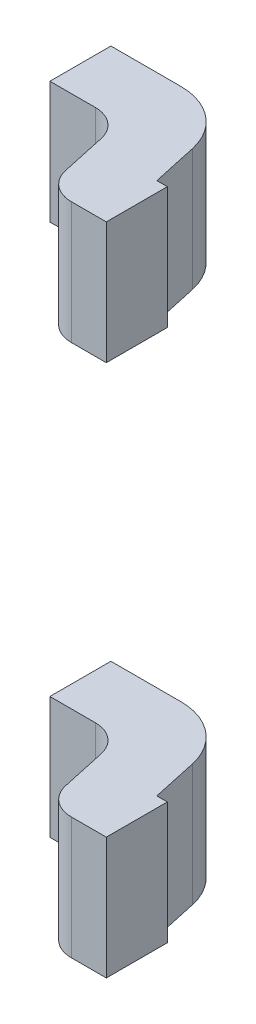
ISO-10303-21;
HEADER;
FILE_DESCRIPTION(('STEP AP214'),'2;1');
FILE_NAME('part.step','',(''),(''),'','','');
FILE_SCHEMA(('AUTOMOTIVE_DESIGN { 1 0 10303 214 1 1 1 1 }'));
ENDSEC;
DATA;
#1=APPLICATION_CONTEXT('core data for automotive mechanical design processes');
#2=APPLICATION_PROTOCOL_DEFINITION('international standard','automotive_design',2000,#1);
#3=PRODUCT_CONTEXT('',#1,'mechanical');
#4=PRODUCT('Part','Part','',(#3));
#5=PRODUCT_RELATED_PRODUCT_CATEGORY('part','',(#4));
#6=PRODUCT_DEFINITION_FORMATION('','',#4);
#7=PRODUCT_DEFINITION_CONTEXT('part definition',#1,'design');
#8=PRODUCT_DEFINITION('design','',#6,#7);
#9=PRODUCT_DEFINITION_SHAPE('','',#8);
#10=(LENGTH_UNIT() NAMED_UNIT(*) SI_UNIT(.MILLI.,.METRE.));
#11=(NAMED_UNIT(*) PLANE_ANGLE_UNIT() SI_UNIT($,.RADIAN.));
#12=(NAMED_UNIT(*) SI_UNIT($,.STERADIAN.) SOLID_ANGLE_UNIT());
#13=UNCERTAINTY_MEASURE_WITH_UNIT(LENGTH_MEASURE(1.E-05),#10,'distance_accuracy_value','');
#14=(GEOMETRIC_REPRESENTATION_CONTEXT(3) GLOBAL_UNCERTAINTY_ASSIGNED_CONTEXT((#13)) GLOBAL_UNIT_ASSIGNED_CONTEXT((#10,
#11,#12)) REPRESENTATION_CONTEXT('',''));
#15=CARTESIAN_POINT('',(0.,0.,0.));
#16=DIRECTION('',(0.,0.,1.));
#17=DIRECTION('',(1.,0.,0.));
#18=AXIS2_PLACEMENT_3D('',#15,#16,#17);
#19=CARTESIAN_POINT('',(-1.185,-1.1675,0.));
#20=DIRECTION('',(0.,1.,0.));
#21=DIRECTION('',(0.,0.,1.));
#22=AXIS2_PLACEMENT_3D('',#19,#20,#21);
#23=PLANE('',#22);
#24=DIRECTION('',(-0.212831260699979,0.,-0.977088969576905));
#25=VECTOR('',#24,1.);
#26=CARTESIAN_POINT('',(-0.76,-1.1675,0.));
#27=LINE('',#26,#25);
#28=CARTESIAN_POINT('',(-0.687293093243104,-1.1675,0.333790799202015));
#29=VERTEX_POINT('',#28);
#30=CARTESIAN_POINT('',(-0.722706906756945,-1.1675,0.171209200797863));
#31=VERTEX_POINT('',#30);
#32=EDGE_CURVE('P0_E121',#29,#31,#27,.T.);
#33=ORIENTED_EDGE('',*,*,#32,.F.);
#34=DIRECTION('',(1.,0.,0.));
#35=VECTOR('',#34,1.);
#36=CARTESIAN_POINT('',(-0.862516850883,-1.1675,0.333790799202));
#37=LINE('',#36,#35);
#38=CARTESIAN_POINT('',(-0.65,-1.1675,0.333790799202));
#39=VERTEX_POINT('',#38);
#40=EDGE_CURVE('P0_E122',#29,#39,#37,.T.);
#41=ORIENTED_EDGE('',*,*,#40,.T.);
#42=DIRECTION('',(0.,0.,-1.));
#43=VECTOR('',#42,1.);
#44=CARTESIAN_POINT('',(-0.65,-1.1675,0.333790799202));
#45=LINE('',#44,#43);
#46=CARTESIAN_POINT('',(-0.65,-1.1675,0.551290799202));
#47=VERTEX_POINT('',#46);
#48=EDGE_CURVE('P0_E118',#47,#39,#45,.T.);
#49=ORIENTED_EDGE('',*,*,#48,.F.);
#50=DIRECTION('',(1.,0.,0.));
#51=VECTOR('',#50,1.);
#52=CARTESIAN_POINT('',(-0.862516850883,-1.1675,0.551290799202));
#53=LINE('',#52,#51);
#54=CARTESIAN_POINT('',(-0.774904972063,-1.1675,0.551290799202));
#55=VERTEX_POINT('',#54);
#56=EDGE_CURVE('P0_E151',#55,#47,#53,.T.);
#57=ORIENTED_EDGE('',*,*,#56,.F.);
#58=CARTESIAN_POINT('',(-0.774904972063,-1.1675,0.442540799202));
#59=DIRECTION('',(0.,1.,0.));
#60=DIRECTION('',(0.,0.,1.));
#61=AXIS2_PLACEMENT_3D('',#58,#59,#60);
#62=CIRCLE('',#61,0.10875);
#63=CARTESIAN_POINT('',(-0.881163397504548,-1.1675,0.465686198803019));
#64=VERTEX_POINT('',#63);
#65=EDGE_CURVE('P0_E155',#64,#55,#62,.T.);
#66=ORIENTED_EDGE('',*,*,#65,.F.);
#67=DIRECTION('',(-0.212831260699979,0.,-0.977088969576905));
#68=VECTOR('',#67,1.);
#69=CARTESIAN_POINT('',(-0.972516850883,-1.1675,0.04629079920223));
#70=LINE('',#69,#68);
#71=CARTESIAN_POINT('',(-0.91657721101835,-1.1675,0.303104600398959));
#72=VERTEX_POINT('',#71);
#73=EDGE_CURVE('P0_E79',#64,#72,#70,.T.);
#74=ORIENTED_EDGE('',*,*,#73,.T.);
#75=CARTESIAN_POINT('',(-1.02283563646,-1.1675,0.32625));
#76=DIRECTION('',(0.,1.,0.));
#77=DIRECTION('',(0.,0.,1.));
#78=AXIS2_PLACEMENT_3D('',#75,#76,#77);
#79=CIRCLE('',#78,0.10875);
#80=CARTESIAN_POINT('',(-1.02283563646,-1.1675,0.2175));
#81=VERTEX_POINT('',#80);
#82=EDGE_CURVE('P0_E20',#72,#81,#79,.T.);
#83=ORIENTED_EDGE('',*,*,#82,.T.);
#84=DIRECTION('',(1.,0.,0.));
#85=VECTOR('',#84,1.);
#86=CARTESIAN_POINT('',(-1.185,-1.1675,0.2175));
#87=LINE('',#86,#85);
#88=CARTESIAN_POINT('',(-1.185,-1.1675,0.2175));
#89=VERTEX_POINT('',#88);
#90=EDGE_CURVE('P0_E86',#89,#81,#87,.T.);
#91=ORIENTED_EDGE('',*,*,#90,.F.);
#92=DIRECTION('',(0.,0.,-1.));
#93=VECTOR('',#92,1.);
#94=CARTESIAN_POINT('',(-1.185,-1.1675,0.));
#95=LINE('',#94,#93);
#96=CARTESIAN_POINT('',(-1.185,-1.1675,0.));
#97=VERTEX_POINT('',#96);
#98=EDGE_CURVE('P0_E92',#89,#97,#95,.T.);
#99=ORIENTED_EDGE('',*,*,#98,.T.);
#100=DIRECTION('',(1.,0.,0.));
#101=VECTOR('',#100,1.);
#102=CARTESIAN_POINT('',(-1.185,-1.1675,0.));
#103=LINE('',#102,#101);
#104=CARTESIAN_POINT('',(-0.93522375764,-1.1675,0.));
#105=VERTEX_POINT('',#104);
#106=EDGE_CURVE('P0_E178',#97,#105,#103,.T.);
#107=ORIENTED_EDGE('',*,*,#106,.T.);
#108=CARTESIAN_POINT('',(-0.93522375764,-1.1675,0.2175));
#109=DIRECTION('',(0.,1.,0.));
#110=DIRECTION('',(0.,0.,1.));
#111=AXIS2_PLACEMENT_3D('',#108,#109,#110);
#112=CIRCLE('',#111,0.2175);
#113=EDGE_CURVE('P0_E204',#31,#105,#112,.T.);
#114=ORIENTED_EDGE('',*,*,#113,.F.);
#115=EDGE_LOOP('',(#33,#41,#49,#57,#66,#74,#83,#91,#99,#107,#114));
#116=FACE_BOUND('',#115,.T.);
#117=ADVANCED_FACE('P0_F17',(#116),#23,.F.);
#118=CARTESIAN_POINT('',(-1.185,-1.1675,0.));
#119=DIRECTION('',(0.,0.,1.));
#120=DIRECTION('',(1.,0.,0.));
#121=AXIS2_PLACEMENT_3D('',#118,#119,#120);
#122=PLANE('',#121);
#123=ORIENTED_EDGE('',*,*,#106,.F.);
#124=DIRECTION('',(0.,1.,0.));
#125=VECTOR('',#124,1.);
#126=CARTESIAN_POINT('',(-1.185,-1.1675,0.));
#127=LINE('',#126,#125);
#128=CARTESIAN_POINT('',(-1.185,-0.7325,0.));
#129=VERTEX_POINT('',#128);
#130=EDGE_CURVE('P0_E162',#97,#129,#127,.T.);
#131=ORIENTED_EDGE('',*,*,#130,.T.);
#132=DIRECTION('',(1.,0.,0.));
#133=VECTOR('',#132,1.);
#134=CARTESIAN_POINT('',(-1.185,-0.7325,0.));
#135=LINE('',#134,#133);
#136=CARTESIAN_POINT('',(-0.93522375764,-0.7325,0.));
#137=VERTEX_POINT('',#136);
#138=EDGE_CURVE('P0_E169',#137,#129,#135,.F.);
#139=ORIENTED_EDGE('',*,*,#138,.F.);
#140=DIRECTION('',(0.,1.,0.));
#141=VECTOR('',#140,1.);
#142=CARTESIAN_POINT('',(-0.93522375764,-1.1675,0.));
#143=LINE('',#142,#141);
#144=EDGE_CURVE('P0_E229',#105,#137,#143,.T.);
#145=ORIENTED_EDGE('',*,*,#144,.F.);
#146=EDGE_LOOP('',(#123,#131,#139,#145));
#147=FACE_BOUND('',#146,.T.);
#148=ADVANCED_FACE('P0_F247',(#147),#122,.F.);
#149=CARTESIAN_POINT('',(-1.185,-1.1675,0.));
#150=DIRECTION('',(1.,0.,0.));
#151=DIRECTION('',(0.,0.,-1.));
#152=AXIS2_PLACEMENT_3D('',#149,#150,#151);
#153=PLANE('',#152);
#154=DIRECTION('',(0.,0.,1.));
#155=VECTOR('',#154,1.);
#156=CARTESIAN_POINT('',(-1.185,-0.7325,0.));
#157=LINE('',#156,#155);
#158=CARTESIAN_POINT('',(-1.185,-0.7325,0.2175));
#159=VERTEX_POINT('',#158);
#160=EDGE_CURVE('P0_E165',#129,#159,#157,.T.);
#161=ORIENTED_EDGE('',*,*,#160,.F.);
#162=ORIENTED_EDGE('',*,*,#130,.F.);
#163=ORIENTED_EDGE('',*,*,#98,.F.);
#164=DIRECTION('',(0.,1.,0.));
#165=VECTOR('',#164,1.);
#166=CARTESIAN_POINT('',(-1.185,-1.1675,0.2175));
#167=LINE('',#166,#165);
#168=EDGE_CURVE('P0_E160',#159,#89,#167,.F.);
#169=ORIENTED_EDGE('',*,*,#168,.F.);
#170=EDGE_LOOP('',(#161,#162,#163,#169));
#171=FACE_BOUND('',#170,.T.);
#172=ADVANCED_FACE('P0_F249',(#171),#153,.F.);
#173=CARTESIAN_POINT('',(-1.185,-1.1675,0.2175));
#174=DIRECTION('',(0.,0.,1.));
#175=DIRECTION('',(1.,0.,0.));
#176=AXIS2_PLACEMENT_3D('',#173,#174,#175);
#177=PLANE('',#176);
#178=ORIENTED_EDGE('',*,*,#90,.T.);
#179=DIRECTION('',(0.,1.,0.));
#180=VECTOR('',#179,1.);
#181=CARTESIAN_POINT('',(-1.02283563646,-1.1675,0.2175));
#182=LINE('',#181,#180);
#183=CARTESIAN_POINT('',(-1.02283563646,-0.7325,0.2175));
#184=VERTEX_POINT('',#183);
#185=EDGE_CURVE('P0_E158',#81,#184,#182,.T.);
#186=ORIENTED_EDGE('',*,*,#185,.T.);
#187=DIRECTION('',(1.,0.,0.));
#188=VECTOR('',#187,1.);
#189=CARTESIAN_POINT('',(-1.185,-0.7325,0.2175));
#190=LINE('',#189,#188);
#191=EDGE_CURVE('P0_E168',#159,#184,#190,.T.);
#192=ORIENTED_EDGE('',*,*,#191,.F.);
#193=ORIENTED_EDGE('',*,*,#168,.T.);
#194=EDGE_LOOP('',(#178,#186,#192,#193));
#195=FACE_BOUND('',#194,.T.);
#196=ADVANCED_FACE('P0_F251',(#195),#177,.T.);
#197=CARTESIAN_POINT('',(-1.02283563646,-1.1675,0.32625));
#198=DIRECTION('',(0.,1.,0.));
#199=DIRECTION('',(0.,0.,1.));
#200=AXIS2_PLACEMENT_3D('',#197,#198,#199);
#201=CYLINDRICAL_SURFACE('',#200,0.10875);
#202=DIRECTION('',(0.,1.,0.));
#203=VECTOR('',#202,1.);
#204=CARTESIAN_POINT('',(-0.916577211018326,-1.1675,0.303104600399071));
#205=LINE('',#204,#203);
#206=CARTESIAN_POINT('',(-0.916577211018136,-0.7325,0.303104600399158));
#207=VERTEX_POINT('',#206);
#208=EDGE_CURVE('P0_E156',#72,#207,#205,.T.);
#209=ORIENTED_EDGE('',*,*,#208,.T.);
#210=CARTESIAN_POINT('',(-1.02283563646,-0.7325,0.32625));
#211=DIRECTION('',(0.,1.,0.));
#212=DIRECTION('',(0.,0.,1.));
#213=AXIS2_PLACEMENT_3D('',#210,#211,#212);
#214=CIRCLE('',#213,0.10875);
#215=EDGE_CURVE('P0_E201',#184,#207,#214,.F.);
#216=ORIENTED_EDGE('',*,*,#215,.F.);
#217=ORIENTED_EDGE('',*,*,#185,.F.);
#218=ORIENTED_EDGE('',*,*,#82,.F.);
#219=EDGE_LOOP('',(#209,#216,#217,#218));
#220=FACE_BOUND('',#219,.T.);
#221=ADVANCED_FACE('P0_F254',(#220),#201,.F.);
#222=CARTESIAN_POINT('',(-0.972516850883,-1.1675,0.04629079920223));
#223=DIRECTION('',(0.977088969576905,0.,-0.212831260699979));
#224=DIRECTION('',(-0.212831260699979,0.,-0.977088969576905));
#225=AXIS2_PLACEMENT_3D('',#222,#223,#224);
#226=PLANE('',#225);
#227=DIRECTION('',(0.212831260695663,0.,0.977088969577845));
#228=VECTOR('',#227,1.);
#229=CARTESIAN_POINT('',(-0.916577211018,-0.7325,0.303104600399));
#230=LINE('',#229,#228);
#231=CARTESIAN_POINT('',(-0.881163397504795,-0.7325,0.465686198802827));
#232=VERTEX_POINT('',#231);
#233=EDGE_CURVE('P0_E200',#207,#232,#230,.T.);
#234=ORIENTED_EDGE('',*,*,#233,.F.);
#235=ORIENTED_EDGE('',*,*,#208,.F.);
#236=ORIENTED_EDGE('',*,*,#73,.F.);
#237=DIRECTION('',(0.,1.,0.));
#238=VECTOR('',#237,1.);
#239=CARTESIAN_POINT('',(-0.881163397504537,-1.1675,0.465686198802899));
#240=LINE('',#239,#238);
#241=EDGE_CURVE('P0_E152',#232,#64,#240,.F.);
#242=ORIENTED_EDGE('',*,*,#241,.F.);
#243=EDGE_LOOP('',(#234,#235,#236,#242));
#244=FACE_BOUND('',#243,.T.);
#245=ADVANCED_FACE('P0_F255',(#244),#226,.F.);
#246=CARTESIAN_POINT('',(-0.774904972063,-1.1675,0.442540799202));
#247=DIRECTION('',(0.,1.,0.));
#248=DIRECTION('',(0.,0.,1.));
#249=AXIS2_PLACEMENT_3D('',#246,#247,#248);
#250=CYLINDRICAL_SURFACE('',#249,0.10875);
#251=CARTESIAN_POINT('',(-0.774904972063,-0.7325,0.442540799202));
#252=DIRECTION('',(0.,1.,0.));
#253=DIRECTION('',(0.,0.,1.));
#254=AXIS2_PLACEMENT_3D('',#251,#252,#253);
#255=CIRCLE('',#254,0.10875);
#256=CARTESIAN_POINT('',(-0.774904972063,-0.7325,0.551290799202));
#257=VERTEX_POINT('',#256);
#258=EDGE_CURVE('P0_E137',#232,#257,#255,.T.);
#259=ORIENTED_EDGE('',*,*,#258,.F.);
#260=ORIENTED_EDGE('',*,*,#241,.T.);
#261=ORIENTED_EDGE('',*,*,#65,.T.);
#262=DIRECTION('',(0.,1.,0.));
#263=VECTOR('',#262,1.);
#264=CARTESIAN_POINT('',(-0.774904972063,-1.1675,0.551290799202));
#265=LINE('',#264,#263);
#266=EDGE_CURVE('P0_E148',#257,#55,#265,.F.);
#267=ORIENTED_EDGE('',*,*,#266,.F.);
#268=EDGE_LOOP('',(#259,#260,#261,#267));
#269=FACE_BOUND('',#268,.T.);
#270=ADVANCED_FACE('P0_F209',(#269),#250,.T.);
#271=CARTESIAN_POINT('',(-0.862516850883,-1.1675,0.551290799202));
#272=DIRECTION('',(0.,0.,1.));
#273=DIRECTION('',(1.,0.,0.));
#274=AXIS2_PLACEMENT_3D('',#271,#272,#273);
#275=PLANE('',#274);
#276=DIRECTION('',(1.,0.,0.));
#277=VECTOR('',#276,1.);
#278=CARTESIAN_POINT('',(-1.185,-0.7325,0.551290799202));
#279=LINE('',#278,#277);
#280=CARTESIAN_POINT('',(-0.65,-0.7325,0.551290799202));
#281=VERTEX_POINT('',#280);
#282=EDGE_CURVE('P0_E135',#257,#281,#279,.T.);
#283=ORIENTED_EDGE('',*,*,#282,.F.);
#284=ORIENTED_EDGE('',*,*,#266,.T.);
#285=ORIENTED_EDGE('',*,*,#56,.T.);
#286=DIRECTION('',(0.,1.,0.));
#287=VECTOR('',#286,1.);
#288=CARTESIAN_POINT('',(-0.65,-1.1675,0.551290799202));
#289=LINE('',#288,#287);
#290=EDGE_CURVE('P0_E144',#281,#47,#289,.F.);
#291=ORIENTED_EDGE('',*,*,#290,.F.);
#292=EDGE_LOOP('',(#283,#284,#285,#291));
#293=FACE_BOUND('',#292,.T.);
#294=ADVANCED_FACE('P0_F211',(#293),#275,.T.);
#295=CARTESIAN_POINT('',(-0.65,-1.1675,0.333790799202));
#296=DIRECTION('',(1.,0.,0.));
#297=DIRECTION('',(0.,0.,-1.));
#298=AXIS2_PLACEMENT_3D('',#295,#296,#297);
#299=PLANE('',#298);
#300=DIRECTION('',(0.,0.,1.));
#301=VECTOR('',#300,1.);
#302=CARTESIAN_POINT('',(-0.65,-0.7325,0.));
#303=LINE('',#302,#301);
#304=CARTESIAN_POINT('',(-0.65,-0.7325,0.333790799202));
#305=VERTEX_POINT('',#304);
#306=EDGE_CURVE('P0_E116',#281,#305,#303,.F.);
#307=ORIENTED_EDGE('',*,*,#306,.F.);
#308=ORIENTED_EDGE('',*,*,#290,.T.);
#309=ORIENTED_EDGE('',*,*,#48,.T.);
#310=DIRECTION('',(0.,1.,0.));
#311=VECTOR('',#310,1.);
#312=CARTESIAN_POINT('',(-0.65,-1.1675,0.333790799202));
#313=LINE('',#312,#311);
#314=EDGE_CURVE('P0_E111',#39,#305,#313,.T.);
#315=ORIENTED_EDGE('',*,*,#314,.T.);
#316=EDGE_LOOP('',(#307,#308,#309,#315));
#317=FACE_BOUND('',#316,.T.);
#318=ADVANCED_FACE('P0_F113',(#317),#299,.T.);
#319=CARTESIAN_POINT('',(-0.862516850883,-1.1675,0.333790799202));
#320=DIRECTION('',(0.,0.,1.));
#321=DIRECTION('',(1.,0.,0.));
#322=AXIS2_PLACEMENT_3D('',#319,#320,#321);
#323=PLANE('',#322);
#324=ORIENTED_EDGE('',*,*,#40,.F.);
#325=DIRECTION('',(0.,1.,0.));
#326=VECTOR('',#325,1.);
#327=CARTESIAN_POINT('',(-0.687293093243104,-1.1675,0.333790799202023));
#328=LINE('',#327,#326);
#329=CARTESIAN_POINT('',(-0.687293093243035,-0.7325,0.333790799202008));
#330=VERTEX_POINT('',#329);
#331=EDGE_CURVE('P0_E128',#330,#29,#328,.F.);
#332=ORIENTED_EDGE('',*,*,#331,.F.);
#333=DIRECTION('',(1.,0.,0.));
#334=VECTOR('',#333,1.);
#335=CARTESIAN_POINT('',(-1.185,-0.7325,0.333790799202));
#336=LINE('',#335,#334);
#337=EDGE_CURVE('P0_E125',#305,#330,#336,.F.);
#338=ORIENTED_EDGE('',*,*,#337,.F.);
#339=ORIENTED_EDGE('',*,*,#314,.F.);
#340=EDGE_LOOP('',(#324,#332,#338,#339));
#341=FACE_BOUND('',#340,.T.);
#342=ADVANCED_FACE('P0_F126',(#341),#323,.F.);
#343=CARTESIAN_POINT('',(-0.76,-1.1675,0.));
#344=DIRECTION('',(0.977088969576905,0.,-0.212831260699979));
#345=DIRECTION('',(-0.212831260699979,0.,-0.977088969576905));
#346=AXIS2_PLACEMENT_3D('',#343,#344,#345);
#347=PLANE('',#346);
#348=DIRECTION('',(-0.212831260701399,0.,-0.977088969576595));
#349=VECTOR('',#348,1.);
#350=CARTESIAN_POINT('',(-0.687293093243,-0.7325,0.333790799202));
#351=LINE('',#350,#349);
#352=CARTESIAN_POINT('',(-0.722706906757045,-0.7325,0.171209200797723));
#353=VERTEX_POINT('',#352);
#354=EDGE_CURVE('P0_E26',#330,#353,#351,.T.);
#355=ORIENTED_EDGE('',*,*,#354,.F.);
#356=ORIENTED_EDGE('',*,*,#331,.T.);
#357=ORIENTED_EDGE('',*,*,#32,.T.);
#358=DIRECTION('',(0.,1.,0.));
#359=VECTOR('',#358,1.);
#360=CARTESIAN_POINT('',(-0.722706906756971,-1.1675,0.171209200797994));
#361=LINE('',#360,#359);
#362=EDGE_CURVE('P0_E35',#353,#31,#361,.F.);
#363=ORIENTED_EDGE('',*,*,#362,.F.);
#364=EDGE_LOOP('',(#355,#356,#357,#363));
#365=FACE_BOUND('',#364,.T.);
#366=ADVANCED_FACE('P0_F237',(#365),#347,.T.);
#367=CARTESIAN_POINT('',(-0.93522375764,-1.1675,0.2175));
#368=DIRECTION('',(0.,1.,0.));
#369=DIRECTION('',(0.,0.,1.));
#370=AXIS2_PLACEMENT_3D('',#367,#368,#369);
#371=CYLINDRICAL_SURFACE('',#370,0.2175);
#372=ORIENTED_EDGE('',*,*,#362,.T.);
#373=ORIENTED_EDGE('',*,*,#113,.T.);
#374=ORIENTED_EDGE('',*,*,#144,.T.);
#375=CARTESIAN_POINT('',(-0.93522375764,-0.7325,0.2175));
#376=DIRECTION('',(0.,1.,0.));
#377=DIRECTION('',(0.,0.,1.));
#378=AXIS2_PLACEMENT_3D('',#375,#376,#377);
#379=CIRCLE('',#378,0.2175);
#380=EDGE_CURVE('P0_E11',#353,#137,#379,.T.);
#381=ORIENTED_EDGE('',*,*,#380,.F.);
#382=EDGE_LOOP('',(#372,#373,#374,#381));
#383=FACE_BOUND('',#382,.T.);
#384=ADVANCED_FACE('P0_F243',(#383),#371,.T.);
#385=CARTESIAN_POINT('',(-1.185,-0.7325,0.));
#386=DIRECTION('',(0.,1.,0.));
#387=DIRECTION('',(0.,0.,1.));
#388=AXIS2_PLACEMENT_3D('',#385,#386,#387);
#389=PLANE('',#388);
#390=ORIENTED_EDGE('',*,*,#354,.T.);
#391=ORIENTED_EDGE('',*,*,#380,.T.);
#392=ORIENTED_EDGE('',*,*,#138,.T.);
#393=ORIENTED_EDGE('',*,*,#160,.T.);
#394=ORIENTED_EDGE('',*,*,#191,.T.);
#395=ORIENTED_EDGE('',*,*,#215,.T.);
#396=ORIENTED_EDGE('',*,*,#233,.T.);
#397=ORIENTED_EDGE('',*,*,#258,.T.);
#398=ORIENTED_EDGE('',*,*,#282,.T.);
#399=ORIENTED_EDGE('',*,*,#306,.T.);
#400=ORIENTED_EDGE('',*,*,#337,.T.);
#401=EDGE_LOOP('',(#390,#391,#392,#393,#394,#395,#396,#397,#398,#399,#400));
#402=FACE_BOUND('',#401,.T.);
#403=ADVANCED_FACE('P0_F132',(#402),#389,.T.);
#404=CLOSED_SHELL('',(#117,#148,#172,#196,#221,#245,#270,#294,#318,#342,#366,#384,#403));
#405=MANIFOLD_SOLID_BREP('P0_B1',#404);
#406=CARTESIAN_POINT('',(-1.185,0.7325,0.));
#407=DIRECTION('',(0.,1.,0.));
#408=DIRECTION('',(0.,0.,1.));
#409=AXIS2_PLACEMENT_3D('',#406,#407,#408);
#410=PLANE('',#409);
#411=DIRECTION('',(-0.212831260699979,0.,-0.977088969576905));
#412=VECTOR('',#411,1.);
#413=CARTESIAN_POINT('',(-0.76,0.7325,0.));
#414=LINE('',#413,#412);
#415=CARTESIAN_POINT('',(-0.687293093243104,0.7325,0.333790799202015));
#416=VERTEX_POINT('',#415);
#417=CARTESIAN_POINT('',(-0.722706906756945,0.7325,0.171209200797863));
#418=VERTEX_POINT('',#417);
#419=EDGE_CURVE('P1_E121',#416,#418,#414,.T.);
#420=ORIENTED_EDGE('',*,*,#419,.F.);
#421=DIRECTION('',(1.,0.,0.));
#422=VECTOR('',#421,1.);
#423=CARTESIAN_POINT('',(-0.862516850883,0.7325,0.333790799202));
#424=LINE('',#423,#422);
#425=CARTESIAN_POINT('',(-0.65,0.7325,0.333790799202));
#426=VERTEX_POINT('',#425);
#427=EDGE_CURVE('P1_E122',#416,#426,#424,.T.);
#428=ORIENTED_EDGE('',*,*,#427,.T.);
#429=DIRECTION('',(0.,0.,-1.));
#430=VECTOR('',#429,1.);
#431=CARTESIAN_POINT('',(-0.65,0.7325,0.333790799202));
#432=LINE('',#431,#430);
#433=CARTESIAN_POINT('',(-0.65,0.7325,0.551290799202));
#434=VERTEX_POINT('',#433);
#435=EDGE_CURVE('P1_E118',#434,#426,#432,.T.);
#436=ORIENTED_EDGE('',*,*,#435,.F.);
#437=DIRECTION('',(1.,0.,0.));
#438=VECTOR('',#437,1.);
#439=CARTESIAN_POINT('',(-0.862516850883,0.7325,0.551290799202));
#440=LINE('',#439,#438);
#441=CARTESIAN_POINT('',(-0.774904972063,0.7325,0.551290799202));
#442=VERTEX_POINT('',#441);
#443=EDGE_CURVE('P1_E151',#442,#434,#440,.T.);
#444=ORIENTED_EDGE('',*,*,#443,.F.);
#445=CARTESIAN_POINT('',(-0.774904972063,0.7325,0.442540799202));
#446=DIRECTION('',(0.,1.,0.));
#447=DIRECTION('',(0.,0.,1.));
#448=AXIS2_PLACEMENT_3D('',#445,#446,#447);
#449=CIRCLE('',#448,0.10875);
#450=CARTESIAN_POINT('',(-0.881163397504548,0.7325,0.465686198803019));
#451=VERTEX_POINT('',#450);
#452=EDGE_CURVE('P1_E155',#451,#442,#449,.T.);
#453=ORIENTED_EDGE('',*,*,#452,.F.);
#454=DIRECTION('',(-0.212831260699979,0.,-0.977088969576905));
#455=VECTOR('',#454,1.);
#456=CARTESIAN_POINT('',(-0.972516850883,0.7325,0.04629079920223));
#457=LINE('',#456,#455);
#458=CARTESIAN_POINT('',(-0.91657721101835,0.7325,0.303104600398959));
#459=VERTEX_POINT('',#458);
#460=EDGE_CURVE('P1_E79',#451,#459,#457,.T.);
#461=ORIENTED_EDGE('',*,*,#460,.T.);
#462=CARTESIAN_POINT('',(-1.02283563646,0.7325,0.32625));
#463=DIRECTION('',(0.,1.,0.));
#464=DIRECTION('',(0.,0.,1.));
#465=AXIS2_PLACEMENT_3D('',#462,#463,#464);
#466=CIRCLE('',#465,0.10875);
#467=CARTESIAN_POINT('',(-1.02283563646,0.7325,0.2175));
#468=VERTEX_POINT('',#467);
#469=EDGE_CURVE('P1_E20',#459,#468,#466,.T.);
#470=ORIENTED_EDGE('',*,*,#469,.T.);
#471=DIRECTION('',(1.,0.,0.));
#472=VECTOR('',#471,1.);
#473=CARTESIAN_POINT('',(-1.185,0.7325,0.2175));
#474=LINE('',#473,#472);
#475=CARTESIAN_POINT('',(-1.185,0.7325,0.2175));
#476=VERTEX_POINT('',#475);
#477=EDGE_CURVE('P1_E86',#476,#468,#474,.T.);
#478=ORIENTED_EDGE('',*,*,#477,.F.);
#479=DIRECTION('',(0.,0.,-1.));
#480=VECTOR('',#479,1.);
#481=CARTESIAN_POINT('',(-1.185,0.7325,0.));
#482=LINE('',#481,#480);
#483=CARTESIAN_POINT('',(-1.185,0.7325,0.));
#484=VERTEX_POINT('',#483);
#485=EDGE_CURVE('P1_E92',#476,#484,#482,.T.);
#486=ORIENTED_EDGE('',*,*,#485,.T.);
#487=DIRECTION('',(1.,0.,0.));
#488=VECTOR('',#487,1.);
#489=CARTESIAN_POINT('',(-1.185,0.7325,0.));
#490=LINE('',#489,#488);
#491=CARTESIAN_POINT('',(-0.93522375764,0.7325,0.));
#492=VERTEX_POINT('',#491);
#493=EDGE_CURVE('P1_E178',#484,#492,#490,.T.);
#494=ORIENTED_EDGE('',*,*,#493,.T.);
#495=CARTESIAN_POINT('',(-0.93522375764,0.7325,0.2175));
#496=DIRECTION('',(0.,1.,0.));
#497=DIRECTION('',(0.,0.,1.));
#498=AXIS2_PLACEMENT_3D('',#495,#496,#497);
#499=CIRCLE('',#498,0.2175);
#500=EDGE_CURVE('P1_E204',#418,#492,#499,.T.);
#501=ORIENTED_EDGE('',*,*,#500,.F.);
#502=EDGE_LOOP('',(#420,#428,#436,#444,#453,#461,#470,#478,#486,#494,#501));
#503=FACE_BOUND('',#502,.T.);
#504=ADVANCED_FACE('P1_F17',(#503),#410,.F.);
#505=CARTESIAN_POINT('',(-1.185,0.7325,0.));
#506=DIRECTION('',(0.,0.,1.));
#507=DIRECTION('',(1.,0.,0.));
#508=AXIS2_PLACEMENT_3D('',#505,#506,#507);
#509=PLANE('',#508);
#510=ORIENTED_EDGE('',*,*,#493,.F.);
#511=DIRECTION('',(0.,1.,0.));
#512=VECTOR('',#511,1.);
#513=CARTESIAN_POINT('',(-1.185,0.7325,0.));
#514=LINE('',#513,#512);
#515=CARTESIAN_POINT('',(-1.185,1.1675,0.));
#516=VERTEX_POINT('',#515);
#517=EDGE_CURVE('P1_E162',#484,#516,#514,.T.);
#518=ORIENTED_EDGE('',*,*,#517,.T.);
#519=DIRECTION('',(1.,0.,0.));
#520=VECTOR('',#519,1.);
#521=CARTESIAN_POINT('',(-1.185,1.1675,0.));
#522=LINE('',#521,#520);
#523=CARTESIAN_POINT('',(-0.93522375764,1.1675,0.));
#524=VERTEX_POINT('',#523);
#525=EDGE_CURVE('P1_E169',#524,#516,#522,.F.);
#526=ORIENTED_EDGE('',*,*,#525,.F.);
#527=DIRECTION('',(0.,1.,0.));
#528=VECTOR('',#527,1.);
#529=CARTESIAN_POINT('',(-0.93522375764,0.7325,0.));
#530=LINE('',#529,#528);
#531=EDGE_CURVE('P1_E229',#492,#524,#530,.T.);
#532=ORIENTED_EDGE('',*,*,#531,.F.);
#533=EDGE_LOOP('',(#510,#518,#526,#532));
#534=FACE_BOUND('',#533,.T.);
#535=ADVANCED_FACE('P1_F247',(#534),#509,.F.);
#536=CARTESIAN_POINT('',(-1.185,0.7325,0.));
#537=DIRECTION('',(1.,0.,0.));
#538=DIRECTION('',(0.,0.,-1.));
#539=AXIS2_PLACEMENT_3D('',#536,#537,#538);
#540=PLANE('',#539);
#541=DIRECTION('',(0.,0.,1.));
#542=VECTOR('',#541,1.);
#543=CARTESIAN_POINT('',(-1.185,1.1675,0.));
#544=LINE('',#543,#542);
#545=CARTESIAN_POINT('',(-1.185,1.1675,0.2175));
#546=VERTEX_POINT('',#545);
#547=EDGE_CURVE('P1_E165',#516,#546,#544,.T.);
#548=ORIENTED_EDGE('',*,*,#547,.F.);
#549=ORIENTED_EDGE('',*,*,#517,.F.);
#550=ORIENTED_EDGE('',*,*,#485,.F.);
#551=DIRECTION('',(0.,1.,0.));
#552=VECTOR('',#551,1.);
#553=CARTESIAN_POINT('',(-1.185,0.7325,0.2175));
#554=LINE('',#553,#552);
#555=EDGE_CURVE('P1_E160',#546,#476,#554,.F.);
#556=ORIENTED_EDGE('',*,*,#555,.F.);
#557=EDGE_LOOP('',(#548,#549,#550,#556));
#558=FACE_BOUND('',#557,.T.);
#559=ADVANCED_FACE('P1_F249',(#558),#540,.F.);
#560=CARTESIAN_POINT('',(-1.185,0.7325,0.2175));
#561=DIRECTION('',(0.,0.,1.));
#562=DIRECTION('',(1.,0.,0.));
#563=AXIS2_PLACEMENT_3D('',#560,#561,#562);
#564=PLANE('',#563);
#565=ORIENTED_EDGE('',*,*,#477,.T.);
#566=DIRECTION('',(0.,1.,0.));
#567=VECTOR('',#566,1.);
#568=CARTESIAN_POINT('',(-1.02283563646,0.7325,0.2175));
#569=LINE('',#568,#567);
#570=CARTESIAN_POINT('',(-1.02283563646,1.1675,0.2175));
#571=VERTEX_POINT('',#570);
#572=EDGE_CURVE('P1_E158',#468,#571,#569,.T.);
#573=ORIENTED_EDGE('',*,*,#572,.T.);
#574=DIRECTION('',(1.,0.,0.));
#575=VECTOR('',#574,1.);
#576=CARTESIAN_POINT('',(-1.185,1.1675,0.2175));
#577=LINE('',#576,#575);
#578=EDGE_CURVE('P1_E168',#546,#571,#577,.T.);
#579=ORIENTED_EDGE('',*,*,#578,.F.);
#580=ORIENTED_EDGE('',*,*,#555,.T.);
#581=EDGE_LOOP('',(#565,#573,#579,#580));
#582=FACE_BOUND('',#581,.T.);
#583=ADVANCED_FACE('P1_F251',(#582),#564,.T.);
#584=CARTESIAN_POINT('',(-1.02283563646,0.7325,0.32625));
#585=DIRECTION('',(0.,1.,0.));
#586=DIRECTION('',(0.,0.,1.));
#587=AXIS2_PLACEMENT_3D('',#584,#585,#586);
#588=CYLINDRICAL_SURFACE('',#587,0.10875);
#589=DIRECTION('',(0.,1.,0.));
#590=VECTOR('',#589,1.);
#591=CARTESIAN_POINT('',(-0.916577211018326,0.7325,0.303104600399071));
#592=LINE('',#591,#590);
#593=CARTESIAN_POINT('',(-0.916577211018136,1.1675,0.303104600399158));
#594=VERTEX_POINT('',#593);
#595=EDGE_CURVE('P1_E156',#459,#594,#592,.T.);
#596=ORIENTED_EDGE('',*,*,#595,.T.);
#597=CARTESIAN_POINT('',(-1.02283563646,1.1675,0.32625));
#598=DIRECTION('',(0.,1.,0.));
#599=DIRECTION('',(0.,0.,1.));
#600=AXIS2_PLACEMENT_3D('',#597,#598,#599);
#601=CIRCLE('',#600,0.10875);
#602=EDGE_CURVE('P1_E201',#571,#594,#601,.F.);
#603=ORIENTED_EDGE('',*,*,#602,.F.);
#604=ORIENTED_EDGE('',*,*,#572,.F.);
#605=ORIENTED_EDGE('',*,*,#469,.F.);
#606=EDGE_LOOP('',(#596,#603,#604,#605));
#607=FACE_BOUND('',#606,.T.);
#608=ADVANCED_FACE('P1_F254',(#607),#588,.F.);
#609=CARTESIAN_POINT('',(-0.972516850883,0.7325,0.04629079920223));
#610=DIRECTION('',(0.977088969576905,0.,-0.212831260699979));
#611=DIRECTION('',(-0.212831260699979,0.,-0.977088969576905));
#612=AXIS2_PLACEMENT_3D('',#609,#610,#611);
#613=PLANE('',#612);
#614=DIRECTION('',(0.212831260695663,0.,0.977088969577845));
#615=VECTOR('',#614,1.);
#616=CARTESIAN_POINT('',(-0.916577211018,1.1675,0.303104600399));
#617=LINE('',#616,#615);
#618=CARTESIAN_POINT('',(-0.881163397504795,1.1675,0.465686198802827));
#619=VERTEX_POINT('',#618);
#620=EDGE_CURVE('P1_E200',#594,#619,#617,.T.);
#621=ORIENTED_EDGE('',*,*,#620,.F.);
#622=ORIENTED_EDGE('',*,*,#595,.F.);
#623=ORIENTED_EDGE('',*,*,#460,.F.);
#624=DIRECTION('',(0.,1.,0.));
#625=VECTOR('',#624,1.);
#626=CARTESIAN_POINT('',(-0.881163397504537,0.7325,0.465686198802899));
#627=LINE('',#626,#625);
#628=EDGE_CURVE('P1_E152',#619,#451,#627,.F.);
#629=ORIENTED_EDGE('',*,*,#628,.F.);
#630=EDGE_LOOP('',(#621,#622,#623,#629));
#631=FACE_BOUND('',#630,.T.);
#632=ADVANCED_FACE('P1_F255',(#631),#613,.F.);
#633=CARTESIAN_POINT('',(-0.774904972063,0.7325,0.442540799202));
#634=DIRECTION('',(0.,1.,0.));
#635=DIRECTION('',(0.,0.,1.));
#636=AXIS2_PLACEMENT_3D('',#633,#634,#635);
#637=CYLINDRICAL_SURFACE('',#636,0.10875);
#638=CARTESIAN_POINT('',(-0.774904972063,1.1675,0.442540799202));
#639=DIRECTION('',(0.,1.,0.));
#640=DIRECTION('',(0.,0.,1.));
#641=AXIS2_PLACEMENT_3D('',#638,#639,#640);
#642=CIRCLE('',#641,0.10875);
#643=CARTESIAN_POINT('',(-0.774904972063,1.1675,0.551290799202));
#644=VERTEX_POINT('',#643);
#645=EDGE_CURVE('P1_E137',#619,#644,#642,.T.);
#646=ORIENTED_EDGE('',*,*,#645,.F.);
#647=ORIENTED_EDGE('',*,*,#628,.T.);
#648=ORIENTED_EDGE('',*,*,#452,.T.);
#649=DIRECTION('',(0.,1.,0.));
#650=VECTOR('',#649,1.);
#651=CARTESIAN_POINT('',(-0.774904972063,0.7325,0.551290799202));
#652=LINE('',#651,#650);
#653=EDGE_CURVE('P1_E148',#644,#442,#652,.F.);
#654=ORIENTED_EDGE('',*,*,#653,.F.);
#655=EDGE_LOOP('',(#646,#647,#648,#654));
#656=FACE_BOUND('',#655,.T.);
#657=ADVANCED_FACE('P1_F209',(#656),#637,.T.);
#658=CARTESIAN_POINT('',(-0.862516850883,0.7325,0.551290799202));
#659=DIRECTION('',(0.,0.,1.));
#660=DIRECTION('',(1.,0.,0.));
#661=AXIS2_PLACEMENT_3D('',#658,#659,#660);
#662=PLANE('',#661);
#663=DIRECTION('',(1.,0.,0.));
#664=VECTOR('',#663,1.);
#665=CARTESIAN_POINT('',(-1.185,1.1675,0.551290799202));
#666=LINE('',#665,#664);
#667=CARTESIAN_POINT('',(-0.65,1.1675,0.551290799202));
#668=VERTEX_POINT('',#667);
#669=EDGE_CURVE('P1_E135',#644,#668,#666,.T.);
#670=ORIENTED_EDGE('',*,*,#669,.F.);
#671=ORIENTED_EDGE('',*,*,#653,.T.);
#672=ORIENTED_EDGE('',*,*,#443,.T.);
#673=DIRECTION('',(0.,1.,0.));
#674=VECTOR('',#673,1.);
#675=CARTESIAN_POINT('',(-0.65,0.7325,0.551290799202));
#676=LINE('',#675,#674);
#677=EDGE_CURVE('P1_E144',#668,#434,#676,.F.);
#678=ORIENTED_EDGE('',*,*,#677,.F.);
#679=EDGE_LOOP('',(#670,#671,#672,#678));
#680=FACE_BOUND('',#679,.T.);
#681=ADVANCED_FACE('P1_F211',(#680),#662,.T.);
#682=CARTESIAN_POINT('',(-0.65,0.7325,0.333790799202));
#683=DIRECTION('',(1.,0.,0.));
#684=DIRECTION('',(0.,0.,-1.));
#685=AXIS2_PLACEMENT_3D('',#682,#683,#684);
#686=PLANE('',#685);
#687=DIRECTION('',(0.,0.,1.));
#688=VECTOR('',#687,1.);
#689=CARTESIAN_POINT('',(-0.65,1.1675,0.));
#690=LINE('',#689,#688);
#691=CARTESIAN_POINT('',(-0.65,1.1675,0.333790799202));
#692=VERTEX_POINT('',#691);
#693=EDGE_CURVE('P1_E116',#668,#692,#690,.F.);
#694=ORIENTED_EDGE('',*,*,#693,.F.);
#695=ORIENTED_EDGE('',*,*,#677,.T.);
#696=ORIENTED_EDGE('',*,*,#435,.T.);
#697=DIRECTION('',(0.,1.,0.));
#698=VECTOR('',#697,1.);
#699=CARTESIAN_POINT('',(-0.65,0.7325,0.333790799202));
#700=LINE('',#699,#698);
#701=EDGE_CURVE('P1_E111',#426,#692,#700,.T.);
#702=ORIENTED_EDGE('',*,*,#701,.T.);
#703=EDGE_LOOP('',(#694,#695,#696,#702));
#704=FACE_BOUND('',#703,.T.);
#705=ADVANCED_FACE('P1_F113',(#704),#686,.T.);
#706=CARTESIAN_POINT('',(-0.862516850883,0.7325,0.333790799202));
#707=DIRECTION('',(0.,0.,1.));
#708=DIRECTION('',(1.,0.,0.));
#709=AXIS2_PLACEMENT_3D('',#706,#707,#708);
#710=PLANE('',#709);
#711=ORIENTED_EDGE('',*,*,#427,.F.);
#712=DIRECTION('',(0.,1.,0.));
#713=VECTOR('',#712,1.);
#714=CARTESIAN_POINT('',(-0.687293093243104,0.7325,0.333790799202023));
#715=LINE('',#714,#713);
#716=CARTESIAN_POINT('',(-0.687293093243035,1.1675,0.333790799202008));
#717=VERTEX_POINT('',#716);
#718=EDGE_CURVE('P1_E128',#717,#416,#715,.F.);
#719=ORIENTED_EDGE('',*,*,#718,.F.);
#720=DIRECTION('',(1.,0.,0.));
#721=VECTOR('',#720,1.);
#722=CARTESIAN_POINT('',(-1.185,1.1675,0.333790799202));
#723=LINE('',#722,#721);
#724=EDGE_CURVE('P1_E125',#692,#717,#723,.F.);
#725=ORIENTED_EDGE('',*,*,#724,.F.);
#726=ORIENTED_EDGE('',*,*,#701,.F.);
#727=EDGE_LOOP('',(#711,#719,#725,#726));
#728=FACE_BOUND('',#727,.T.);
#729=ADVANCED_FACE('P1_F126',(#728),#710,.F.);
#730=CARTESIAN_POINT('',(-0.76,0.7325,0.));
#731=DIRECTION('',(0.977088969576905,0.,-0.212831260699979));
#732=DIRECTION('',(-0.212831260699979,0.,-0.977088969576905));
#733=AXIS2_PLACEMENT_3D('',#730,#731,#732);
#734=PLANE('',#733);
#735=DIRECTION('',(-0.212831260701399,0.,-0.977088969576595));
#736=VECTOR('',#735,1.);
#737=CARTESIAN_POINT('',(-0.687293093243,1.1675,0.333790799202));
#738=LINE('',#737,#736);
#739=CARTESIAN_POINT('',(-0.722706906757045,1.1675,0.171209200797723));
#740=VERTEX_POINT('',#739);
#741=EDGE_CURVE('P1_E26',#717,#740,#738,.T.);
#742=ORIENTED_EDGE('',*,*,#741,.F.);
#743=ORIENTED_EDGE('',*,*,#718,.T.);
#744=ORIENTED_EDGE('',*,*,#419,.T.);
#745=DIRECTION('',(0.,1.,0.));
#746=VECTOR('',#745,1.);
#747=CARTESIAN_POINT('',(-0.722706906756971,0.7325,0.171209200797994));
#748=LINE('',#747,#746);
#749=EDGE_CURVE('P1_E35',#740,#418,#748,.F.);
#750=ORIENTED_EDGE('',*,*,#749,.F.);
#751=EDGE_LOOP('',(#742,#743,#744,#750));
#752=FACE_BOUND('',#751,.T.);
#753=ADVANCED_FACE('P1_F237',(#752),#734,.T.);
#754=CARTESIAN_POINT('',(-0.93522375764,0.7325,0.2175));
#755=DIRECTION('',(0.,1.,0.));
#756=DIRECTION('',(0.,0.,1.));
#757=AXIS2_PLACEMENT_3D('',#754,#755,#756);
#758=CYLINDRICAL_SURFACE('',#757,0.2175);
#759=ORIENTED_EDGE('',*,*,#749,.T.);
#760=ORIENTED_EDGE('',*,*,#500,.T.);
#761=ORIENTED_EDGE('',*,*,#531,.T.);
#762=CARTESIAN_POINT('',(-0.93522375764,1.1675,0.2175));
#763=DIRECTION('',(0.,1.,0.));
#764=DIRECTION('',(0.,0.,1.));
#765=AXIS2_PLACEMENT_3D('',#762,#763,#764);
#766=CIRCLE('',#765,0.2175);
#767=EDGE_CURVE('P1_E11',#740,#524,#766,.T.);
#768=ORIENTED_EDGE('',*,*,#767,.F.);
#769=EDGE_LOOP('',(#759,#760,#761,#768));
#770=FACE_BOUND('',#769,.T.);
#771=ADVANCED_FACE('P1_F243',(#770),#758,.T.);
#772=CARTESIAN_POINT('',(-1.185,1.1675,0.));
#773=DIRECTION('',(0.,1.,0.));
#774=DIRECTION('',(0.,0.,1.));
#775=AXIS2_PLACEMENT_3D('',#772,#773,#774);
#776=PLANE('',#775);
#777=ORIENTED_EDGE('',*,*,#741,.T.);
#778=ORIENTED_EDGE('',*,*,#767,.T.);
#779=ORIENTED_EDGE('',*,*,#525,.T.);
#780=ORIENTED_EDGE('',*,*,#547,.T.);
#781=ORIENTED_EDGE('',*,*,#578,.T.);
#782=ORIENTED_EDGE('',*,*,#602,.T.);
#783=ORIENTED_EDGE('',*,*,#620,.T.);
#784=ORIENTED_EDGE('',*,*,#645,.T.);
#785=ORIENTED_EDGE('',*,*,#669,.T.);
#786=ORIENTED_EDGE('',*,*,#693,.T.);
#787=ORIENTED_EDGE('',*,*,#724,.T.);
#788=EDGE_LOOP('',(#777,#778,#779,#780,#781,#782,#783,#784,#785,#786,#787));
#789=FACE_BOUND('',#788,.T.);
#790=ADVANCED_FACE('P1_F132',(#789),#776,.T.);
#791=CLOSED_SHELL('',(#504,#535,#559,#583,#608,#632,#657,#681,#705,#729,#753,#771,#790));
#792=MANIFOLD_SOLID_BREP('P1_B1',#791);
#793=ADVANCED_BREP_SHAPE_REPRESENTATION('',(#18,#405,#792),#14);
#794=SHAPE_DEFINITION_REPRESENTATION(#9,#793);
ENDSEC;
END-ISO-10303-21;
